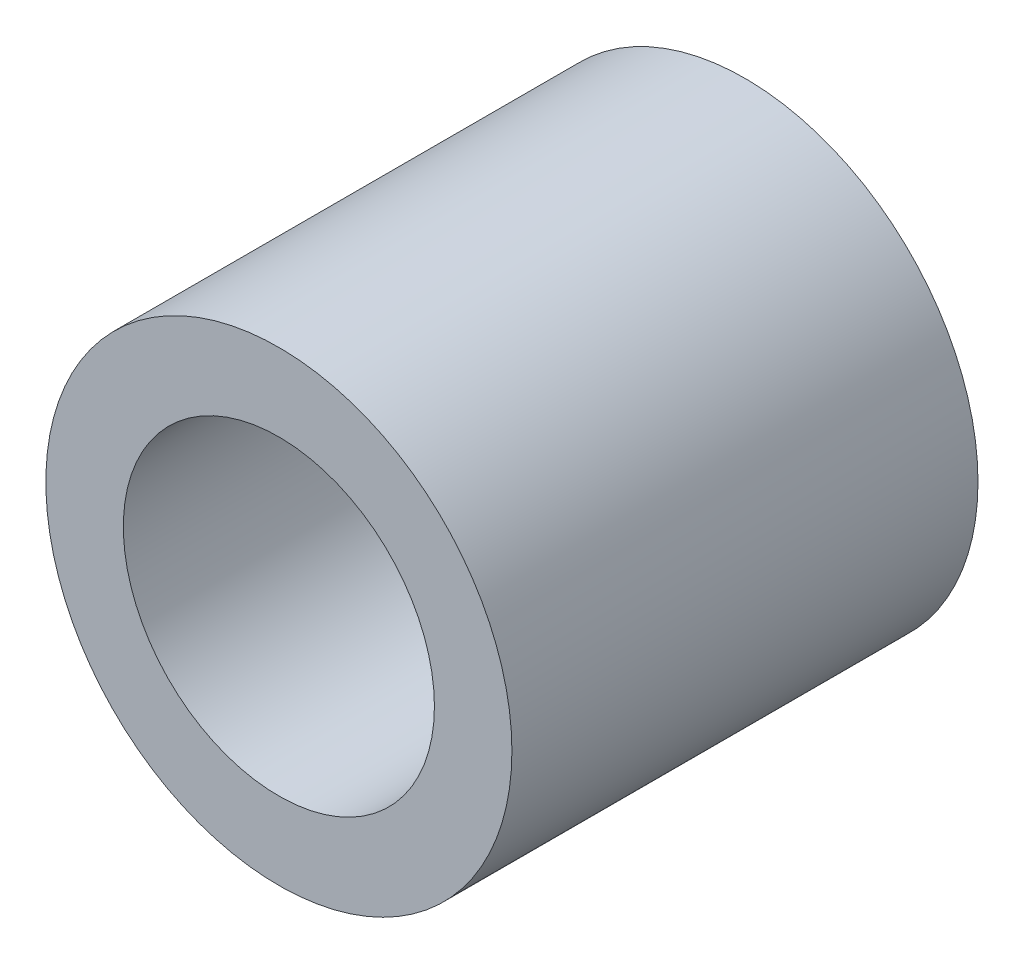
ISO-10303-21;
HEADER;
FILE_DESCRIPTION(('STEP AP214'),'2;1');
FILE_NAME('part.step','',(''),(''),'','','');
FILE_SCHEMA(('AUTOMOTIVE_DESIGN { 1 0 10303 214 1 1 1 1 }'));
ENDSEC;
DATA;
#1=APPLICATION_CONTEXT('core data for automotive mechanical design processes');
#2=APPLICATION_PROTOCOL_DEFINITION('international standard','automotive_design',2000,#1);
#3=PRODUCT_CONTEXT('',#1,'mechanical');
#4=PRODUCT('Part','Part','',(#3));
#5=PRODUCT_RELATED_PRODUCT_CATEGORY('part','',(#4));
#6=PRODUCT_DEFINITION_FORMATION('','',#4);
#7=PRODUCT_DEFINITION_CONTEXT('part definition',#1,'design');
#8=PRODUCT_DEFINITION('design','',#6,#7);
#9=PRODUCT_DEFINITION_SHAPE('','',#8);
#10=(LENGTH_UNIT() NAMED_UNIT(*) SI_UNIT(.MILLI.,.METRE.));
#11=(NAMED_UNIT(*) PLANE_ANGLE_UNIT() SI_UNIT($,.RADIAN.));
#12=(NAMED_UNIT(*) SI_UNIT($,.STERADIAN.) SOLID_ANGLE_UNIT());
#13=UNCERTAINTY_MEASURE_WITH_UNIT(LENGTH_MEASURE(1.E-05),#10,'distance_accuracy_value','');
#14=(GEOMETRIC_REPRESENTATION_CONTEXT(3) GLOBAL_UNCERTAINTY_ASSIGNED_CONTEXT((#13)) GLOBAL_UNIT_ASSIGNED_CONTEXT((#10,
#11,#12)) REPRESENTATION_CONTEXT('',''));
#15=CARTESIAN_POINT('',(0.,0.,0.));
#16=DIRECTION('',(0.,0.,1.));
#17=DIRECTION('',(1.,0.,0.));
#18=AXIS2_PLACEMENT_3D('',#15,#16,#17);
#19=CARTESIAN_POINT('',(0.,0.,-4.7625));
#20=DIRECTION('',(0.,0.,1.));
#21=DIRECTION('',(1.,0.,0.));
#22=AXIS2_PLACEMENT_3D('',#19,#20,#21);
#23=CYLINDRICAL_SURFACE('',#22,4.7625);
#24=CARTESIAN_POINT('',(0.,0.,-4.7625));
#25=DIRECTION('',(0.,0.,1.));
#26=DIRECTION('',(1.,0.,0.));
#27=AXIS2_PLACEMENT_3D('',#24,#25,#26);
#28=CIRCLE('',#27,4.7625);
#29=CARTESIAN_POINT('',(4.7625,0.,-4.7625));
#30=VERTEX_POINT('',#29);
#31=EDGE_CURVE('E10',#30,#30,#28,.T.);
#32=CARTESIAN_POINT('',(0.,0.,4.7625));
#33=DIRECTION('',(0.,0.,1.));
#34=DIRECTION('',(1.,0.,0.));
#35=AXIS2_PLACEMENT_3D('',#32,#33,#34);
#36=CIRCLE('',#35,4.7625);
#37=CARTESIAN_POINT('',(4.7625,0.,4.7625));
#38=VERTEX_POINT('',#37);
#39=EDGE_CURVE('E45',#38,#38,#36,.T.);
#40=CARTESIAN_POINT('',(4.7625,0.,-4.7625));
#41=CARTESIAN_POINT('',(4.7625,0.,-4.66328125));
#42=CARTESIAN_POINT('',(4.7625,0.,-4.5640625));
#43=CARTESIAN_POINT('',(4.7625,0.,-4.365625));
#44=CARTESIAN_POINT('',(4.7625,0.,-4.26640625));
#45=CARTESIAN_POINT('',(4.7625,0.,-4.06796875));
#46=CARTESIAN_POINT('',(4.7625,0.,-3.96875));
#47=CARTESIAN_POINT('',(4.7625,0.,-3.7703125));
#48=CARTESIAN_POINT('',(4.7625,0.,-3.67109375));
#49=CARTESIAN_POINT('',(4.7625,0.,-3.47265625));
#50=CARTESIAN_POINT('',(4.7625,0.,-3.3734375));
#51=CARTESIAN_POINT('',(4.7625,0.,-3.175));
#52=CARTESIAN_POINT('',(4.7625,0.,-3.07578125));
#53=CARTESIAN_POINT('',(4.7625,0.,-2.87734375));
#54=CARTESIAN_POINT('',(4.7625,0.,-2.778125));
#55=CARTESIAN_POINT('',(4.7625,0.,-2.5796875));
#56=CARTESIAN_POINT('',(4.7625,0.,-2.48046875));
#57=CARTESIAN_POINT('',(4.7625,0.,-2.28203125));
#58=CARTESIAN_POINT('',(4.7625,0.,-2.1828125));
#59=CARTESIAN_POINT('',(4.7625,0.,-1.984375));
#60=CARTESIAN_POINT('',(4.7625,0.,-1.88515625));
#61=CARTESIAN_POINT('',(4.7625,0.,-1.68671875));
#62=CARTESIAN_POINT('',(4.7625,0.,-1.5875));
#63=CARTESIAN_POINT('',(4.7625,0.,-1.3890625));
#64=CARTESIAN_POINT('',(4.7625,0.,-1.28984375));
#65=CARTESIAN_POINT('',(4.7625,0.,-1.09140625));
#66=CARTESIAN_POINT('',(4.7625,0.,-0.9921875));
#67=CARTESIAN_POINT('',(4.7625,0.,-0.79375));
#68=CARTESIAN_POINT('',(4.7625,0.,-0.69453125));
#69=CARTESIAN_POINT('',(4.7625,0.,-0.49609375));
#70=CARTESIAN_POINT('',(4.7625,0.,-0.396875));
#71=CARTESIAN_POINT('',(4.7625,0.,-0.1984375));
#72=CARTESIAN_POINT('',(4.7625,0.,-0.0992187500000001));
#73=CARTESIAN_POINT('',(4.7625,0.,0.0992187500000001));
#74=CARTESIAN_POINT('',(4.7625,0.,0.1984375));
#75=CARTESIAN_POINT('',(4.7625,0.,0.396875));
#76=CARTESIAN_POINT('',(4.7625,0.,0.49609375));
#77=CARTESIAN_POINT('',(4.7625,0.,0.69453125));
#78=CARTESIAN_POINT('',(4.7625,0.,0.793750000000001));
#79=CARTESIAN_POINT('',(4.7625,0.,0.992187500000001));
#80=CARTESIAN_POINT('',(4.7625,0.,1.09140625));
#81=CARTESIAN_POINT('',(4.7625,0.,1.28984375));
#82=CARTESIAN_POINT('',(4.7625,0.,1.3890625));
#83=CARTESIAN_POINT('',(4.7625,0.,1.5875));
#84=CARTESIAN_POINT('',(4.7625,0.,1.68671875));
#85=CARTESIAN_POINT('',(4.7625,0.,1.88515625));
#86=CARTESIAN_POINT('',(4.7625,0.,1.984375));
#87=CARTESIAN_POINT('',(4.7625,0.,2.1828125));
#88=CARTESIAN_POINT('',(4.7625,0.,2.28203125));
#89=CARTESIAN_POINT('',(4.7625,0.,2.48046875));
#90=CARTESIAN_POINT('',(4.7625,0.,2.5796875));
#91=CARTESIAN_POINT('',(4.7625,0.,2.778125));
#92=CARTESIAN_POINT('',(4.7625,0.,2.87734375));
#93=CARTESIAN_POINT('',(4.7625,0.,3.07578125));
#94=CARTESIAN_POINT('',(4.7625,0.,3.175));
#95=CARTESIAN_POINT('',(4.7625,0.,3.3734375));
#96=CARTESIAN_POINT('',(4.7625,0.,3.47265625));
#97=CARTESIAN_POINT('',(4.7625,0.,3.67109375));
#98=CARTESIAN_POINT('',(4.7625,0.,3.7703125));
#99=CARTESIAN_POINT('',(4.7625,0.,3.96875));
#100=CARTESIAN_POINT('',(4.7625,0.,4.06796875));
#101=CARTESIAN_POINT('',(4.7625,0.,4.26640625));
#102=CARTESIAN_POINT('',(4.7625,0.,4.365625));
#103=CARTESIAN_POINT('',(4.7625,0.,4.5640625));
#104=CARTESIAN_POINT('',(4.7625,0.,4.66328125));
#105=CARTESIAN_POINT('',(4.7625,0.,4.7625));
#106=B_SPLINE_CURVE_WITH_KNOTS('',3,(#40,#41,#42,#43,#44,#45,#46,#47,#48,#49,#50,#51,#52,#53,
#54,#55,#56,#57,#58,#59,#60,#61,#62,#63,#64,#65,#66,#67,#68,#69,#70,#71,#72,#73,#74,#75,#76,#77,
#78,#79,#80,#81,#82,#83,#84,#85,#86,#87,#88,#89,#90,#91,#92,#93,#94,#95,#96,#97,#98,#99,#100,
#101,#102,#103,#104,#105),.UNSPECIFIED.,.F.,.F.,(4,2,2,2,2,2,2,2,2,2,2,2,2,2,2,2,2,2,2,2,2,2,2,
2,2,2,2,2,2,2,2,2,4),(0.,0.297656249999999,0.595312499999999,0.89296875,1.190625,1.48828125,
1.7859375,2.08359375,2.38125,2.67890625,2.9765625,3.27421875,3.571875,3.86953125,4.1671875,
4.46484375,4.7625,5.06015625,5.3578125,5.65546875,5.953125,6.25078125,6.5484375,6.84609375,
7.14375,7.44140625,7.7390625,8.03671875,8.334375,8.63203125,8.9296875,9.22734375,9.525),.UNSPECIFIED.);
#107=EDGE_CURVE('BSEAM35',#30,#38,#106,.T.);
#108=ORIENTED_EDGE('',*,*,#31,.T.);
#109=ORIENTED_EDGE('',*,*,#39,.F.);
#110=ORIENTED_EDGE('',*,*,#107,.T.);
#111=ORIENTED_EDGE('',*,*,#107,.F.);
#112=EDGE_LOOP('',(#108,#110,#109,#111));
#113=FACE_BOUND('',#112,.T.);
#114=ADVANCED_FACE('F35',(#113),#23,.T.);
#115=CARTESIAN_POINT('',(0.,0.,-4.7625));
#116=DIRECTION('',(0.,0.,1.));
#117=DIRECTION('',(1.,0.,0.));
#118=AXIS2_PLACEMENT_3D('',#115,#116,#117);
#119=PLANE('',#118);
#120=CARTESIAN_POINT('',(0.,0.,-4.7625));
#121=DIRECTION('',(0.,0.,1.));
#122=DIRECTION('',(1.,0.,0.));
#123=AXIS2_PLACEMENT_3D('',#120,#121,#122);
#124=CIRCLE('',#123,3.17881);
#125=CARTESIAN_POINT('',(3.17881,0.,-4.7625));
#126=VERTEX_POINT('',#125);
#127=EDGE_CURVE('E41',#126,#126,#124,.T.);
#128=ORIENTED_EDGE('',*,*,#127,.T.);
#129=EDGE_LOOP('',(#128));
#130=FACE_BOUND('',#129,.T.);
#131=ORIENTED_EDGE('',*,*,#31,.F.);
#132=EDGE_LOOP('',(#131));
#133=FACE_BOUND('',#132,.T.);
#134=ADVANCED_FACE('F64',(#130,#133),#119,.F.);
#135=CARTESIAN_POINT('',(0.,0.,-4.7625));
#136=DIRECTION('',(0.,0.,1.));
#137=DIRECTION('',(1.,0.,0.));
#138=AXIS2_PLACEMENT_3D('',#135,#136,#137);
#139=CYLINDRICAL_SURFACE('',#138,3.17881);
#140=CARTESIAN_POINT('',(0.,0.,4.7625));
#141=DIRECTION('',(0.,0.,1.));
#142=DIRECTION('',(1.,0.,0.));
#143=AXIS2_PLACEMENT_3D('',#140,#141,#142);
#144=CIRCLE('',#143,3.17881);
#145=CARTESIAN_POINT('',(3.17881,0.,4.7625));
#146=VERTEX_POINT('',#145);
#147=EDGE_CURVE('E49',#146,#146,#144,.T.);
#148=CARTESIAN_POINT('',(3.17881,0.,-4.7625));
#149=CARTESIAN_POINT('',(3.17881,0.,-4.66328125));
#150=CARTESIAN_POINT('',(3.17881,0.,-4.5640625));
#151=CARTESIAN_POINT('',(3.17881,0.,-4.365625));
#152=CARTESIAN_POINT('',(3.17881,0.,-4.26640625));
#153=CARTESIAN_POINT('',(3.17881,0.,-4.06796875));
#154=CARTESIAN_POINT('',(3.17881,0.,-3.96875));
#155=CARTESIAN_POINT('',(3.17881,0.,-3.7703125));
#156=CARTESIAN_POINT('',(3.17881,0.,-3.67109375));
#157=CARTESIAN_POINT('',(3.17881,0.,-3.47265625));
#158=CARTESIAN_POINT('',(3.17881,0.,-3.3734375));
#159=CARTESIAN_POINT('',(3.17881,0.,-3.175));
#160=CARTESIAN_POINT('',(3.17881,0.,-3.07578125));
#161=CARTESIAN_POINT('',(3.17881,0.,-2.87734375));
#162=CARTESIAN_POINT('',(3.17881,0.,-2.778125));
#163=CARTESIAN_POINT('',(3.17881,0.,-2.5796875));
#164=CARTESIAN_POINT('',(3.17881,0.,-2.48046875));
#165=CARTESIAN_POINT('',(3.17881,0.,-2.28203125));
#166=CARTESIAN_POINT('',(3.17881,0.,-2.1828125));
#167=CARTESIAN_POINT('',(3.17881,0.,-1.984375));
#168=CARTESIAN_POINT('',(3.17881,0.,-1.88515625));
#169=CARTESIAN_POINT('',(3.17881,0.,-1.68671875));
#170=CARTESIAN_POINT('',(3.17881,0.,-1.5875));
#171=CARTESIAN_POINT('',(3.17881,0.,-1.3890625));
#172=CARTESIAN_POINT('',(3.17881,0.,-1.28984375));
#173=CARTESIAN_POINT('',(3.17881,0.,-1.09140625));
#174=CARTESIAN_POINT('',(3.17881,0.,-0.9921875));
#175=CARTESIAN_POINT('',(3.17881,0.,-0.793750000000001));
#176=CARTESIAN_POINT('',(3.17881,0.,-0.694531250000001));
#177=CARTESIAN_POINT('',(3.17881,0.,-0.496093750000001));
#178=CARTESIAN_POINT('',(3.17881,0.,-0.396875000000001));
#179=CARTESIAN_POINT('',(3.17881,0.,-0.198437500000001));
#180=CARTESIAN_POINT('',(3.17881,0.,-0.0992187500000009));
#181=CARTESIAN_POINT('',(3.17881,0.,0.0992187499999992));
#182=CARTESIAN_POINT('',(3.17881,0.,0.198437499999999));
#183=CARTESIAN_POINT('',(3.17881,0.,0.396874999999999));
#184=CARTESIAN_POINT('',(3.17881,0.,0.496093749999999));
#185=CARTESIAN_POINT('',(3.17881,0.,0.694531249999999));
#186=CARTESIAN_POINT('',(3.17881,0.,0.79375));
#187=CARTESIAN_POINT('',(3.17881,0.,0.9921875));
#188=CARTESIAN_POINT('',(3.17881,0.,1.09140625));
#189=CARTESIAN_POINT('',(3.17881,0.,1.28984375));
#190=CARTESIAN_POINT('',(3.17881,0.,1.3890625));
#191=CARTESIAN_POINT('',(3.17881,0.,1.5875));
#192=CARTESIAN_POINT('',(3.17881,0.,1.68671875));
#193=CARTESIAN_POINT('',(3.17881,0.,1.88515625));
#194=CARTESIAN_POINT('',(3.17881,0.,1.984375));
#195=CARTESIAN_POINT('',(3.17881,0.,2.1828125));
#196=CARTESIAN_POINT('',(3.17881,0.,2.28203125));
#197=CARTESIAN_POINT('',(3.17881,0.,2.48046875));
#198=CARTESIAN_POINT('',(3.17881,0.,2.5796875));
#199=CARTESIAN_POINT('',(3.17881,0.,2.778125));
#200=CARTESIAN_POINT('',(3.17881,0.,2.87734375));
#201=CARTESIAN_POINT('',(3.17881,0.,3.07578125));
#202=CARTESIAN_POINT('',(3.17881,0.,3.175));
#203=CARTESIAN_POINT('',(3.17881,0.,3.3734375));
#204=CARTESIAN_POINT('',(3.17881,0.,3.47265625));
#205=CARTESIAN_POINT('',(3.17881,0.,3.67109375));
#206=CARTESIAN_POINT('',(3.17881,0.,3.7703125));
#207=CARTESIAN_POINT('',(3.17881,0.,3.96875));
#208=CARTESIAN_POINT('',(3.17881,0.,4.06796875));
#209=CARTESIAN_POINT('',(3.17881,0.,4.26640625));
#210=CARTESIAN_POINT('',(3.17881,0.,4.365625));
#211=CARTESIAN_POINT('',(3.17881,0.,4.5640625));
#212=CARTESIAN_POINT('',(3.17881,0.,4.66328125));
#213=CARTESIAN_POINT('',(3.17881,0.,4.7625));
#214=B_SPLINE_CURVE_WITH_KNOTS('',3,(#148,#149,#150,#151,#152,#153,#154,#155,#156,#157,#158,
#159,#160,#161,#162,#163,#164,#165,#166,#167,#168,#169,#170,#171,#172,#173,#174,#175,#176,#177,
#178,#179,#180,#181,#182,#183,#184,#185,#186,#187,#188,#189,#190,#191,#192,#193,#194,#195,#196,
#197,#198,#199,#200,#201,#202,#203,#204,#205,#206,#207,#208,#209,#210,#211,#212,#213),
.UNSPECIFIED.,.F.,.F.,(4,2,2,2,2,2,2,2,2,2,2,2,2,2,2,2,2,2,2,2,2,2,2,2,2,2,2,2,2,2,2,2,4),(0.,
0.29765625,0.5953125,0.892968750000001,1.190625,1.48828125,1.7859375,2.08359375,2.38125,
2.67890625,2.9765625,3.27421875,3.571875,3.86953125,4.1671875,4.46484375,4.7625,5.06015625,
5.3578125,5.65546875,5.953125,6.25078125,6.5484375,6.84609375,7.14375,7.44140625,7.7390625,
8.03671875,8.334375,8.63203125,8.9296875,9.22734375,9.525),.UNSPECIFIED.);
#215=EDGE_CURVE('BSEAM55',#126,#146,#214,.T.);
#216=ORIENTED_EDGE('',*,*,#127,.F.);
#217=ORIENTED_EDGE('',*,*,#147,.T.);
#218=ORIENTED_EDGE('',*,*,#215,.T.);
#219=ORIENTED_EDGE('',*,*,#215,.F.);
#220=EDGE_LOOP('',(#216,#218,#217,#219));
#221=FACE_BOUND('',#220,.T.);
#222=ADVANCED_FACE('F55',(#221),#139,.F.);
#223=CARTESIAN_POINT('',(0.,0.,4.7625));
#224=DIRECTION('',(0.,0.,1.));
#225=DIRECTION('',(1.,0.,0.));
#226=AXIS2_PLACEMENT_3D('',#223,#224,#225);
#227=PLANE('',#226);
#228=ORIENTED_EDGE('',*,*,#39,.T.);
#229=EDGE_LOOP('',(#228));
#230=FACE_BOUND('',#229,.T.);
#231=ORIENTED_EDGE('',*,*,#147,.F.);
#232=EDGE_LOOP('',(#231));
#233=FACE_BOUND('',#232,.T.);
#234=ADVANCED_FACE('F57',(#230,#233),#227,.T.);
#235=CLOSED_SHELL('',(#114,#134,#222,#234));
#236=MANIFOLD_SOLID_BREP('B2',#235);
#237=ADVANCED_BREP_SHAPE_REPRESENTATION('',(#18,#236),#14);
#238=SHAPE_DEFINITION_REPRESENTATION(#9,#237);
ENDSEC;
END-ISO-10303-21;
